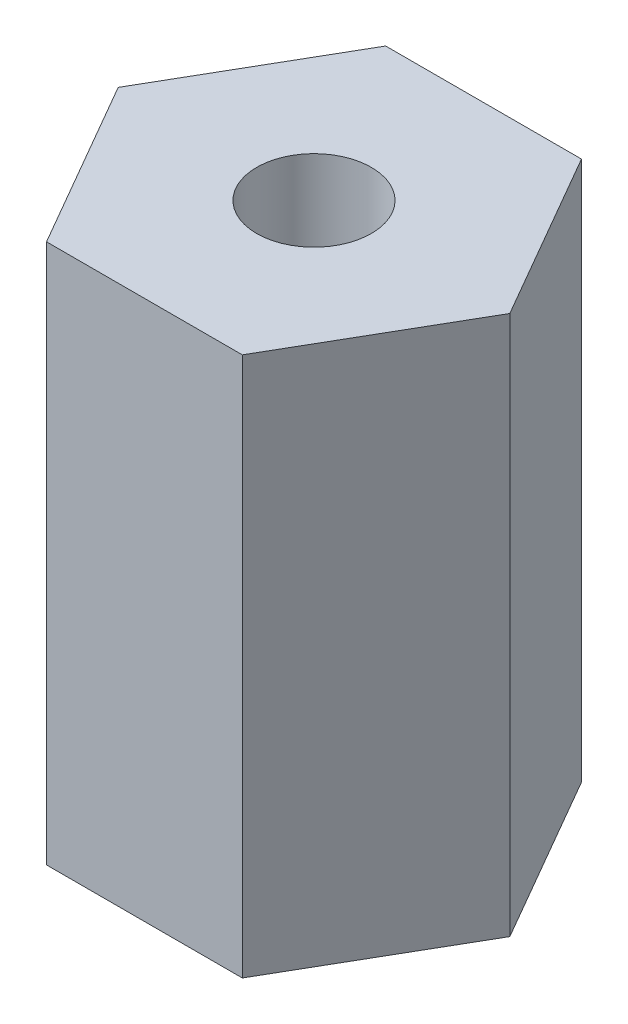
ISO-10303-21;
HEADER;
FILE_DESCRIPTION(('STEP AP214'),'2;1');
FILE_NAME('part.step','',(''),(''),'','','');
FILE_SCHEMA(('AUTOMOTIVE_DESIGN { 1 0 10303 214 1 1 1 1 }'));
ENDSEC;
DATA;
#1=APPLICATION_CONTEXT('core data for automotive mechanical design processes');
#2=APPLICATION_PROTOCOL_DEFINITION('international standard','automotive_design',2000,#1);
#3=PRODUCT_CONTEXT('',#1,'mechanical');
#4=PRODUCT('Part','Part','',(#3));
#5=PRODUCT_RELATED_PRODUCT_CATEGORY('part','',(#4));
#6=PRODUCT_DEFINITION_FORMATION('','',#4);
#7=PRODUCT_DEFINITION_CONTEXT('part definition',#1,'design');
#8=PRODUCT_DEFINITION('design','',#6,#7);
#9=PRODUCT_DEFINITION_SHAPE('','',#8);
#10=(LENGTH_UNIT() NAMED_UNIT(*) SI_UNIT(.MILLI.,.METRE.));
#11=(NAMED_UNIT(*) PLANE_ANGLE_UNIT() SI_UNIT($,.RADIAN.));
#12=(NAMED_UNIT(*) SI_UNIT($,.STERADIAN.) SOLID_ANGLE_UNIT());
#13=UNCERTAINTY_MEASURE_WITH_UNIT(LENGTH_MEASURE(1.E-05),#10,'distance_accuracy_value','');
#14=(GEOMETRIC_REPRESENTATION_CONTEXT(3) GLOBAL_UNCERTAINTY_ASSIGNED_CONTEXT((#13)) GLOBAL_UNIT_ASSIGNED_CONTEXT((#10,
#11,#12)) REPRESENTATION_CONTEXT('',''));
#15=CARTESIAN_POINT('',(0.,0.,0.));
#16=DIRECTION('',(0.,0.,1.));
#17=DIRECTION('',(1.,0.,0.));
#18=AXIS2_PLACEMENT_3D('',#15,#16,#17);
#19=CARTESIAN_POINT('',(2.3094010767585,12.73,-4.));
#20=DIRECTION('',(0.,0.,1.));
#21=DIRECTION('',(1.,0.,0.));
#22=AXIS2_PLACEMENT_3D('',#19,#20,#21);
#23=PLANE('',#22);
#24=DIRECTION('',(-1.,0.,0.));
#25=VECTOR('',#24,1.);
#26=CARTESIAN_POINT('',(2.3094010767585,0.,-4.));
#27=LINE('',#26,#25);
#28=CARTESIAN_POINT('',(2.3094010767585,0.,-4.));
#29=VERTEX_POINT('',#28);
#30=CARTESIAN_POINT('',(-2.3094010767585,0.,-4.));
#31=VERTEX_POINT('',#30);
#32=EDGE_CURVE('E128',#29,#31,#27,.T.);
#33=ORIENTED_EDGE('',*,*,#32,.T.);
#34=DIRECTION('',(0.,-1.,0.));
#35=VECTOR('',#34,1.);
#36=CARTESIAN_POINT('',(-2.3094010767585,12.73,-4.));
#37=LINE('',#36,#35);
#38=CARTESIAN_POINT('',(-2.3094010767585,12.73,-4.));
#39=VERTEX_POINT('',#38);
#40=EDGE_CURVE('E11',#39,#31,#37,.T.);
#41=ORIENTED_EDGE('',*,*,#40,.F.);
#42=DIRECTION('',(-1.,0.,0.));
#43=VECTOR('',#42,1.);
#44=CARTESIAN_POINT('',(2.3094010767585,12.73,-4.));
#45=LINE('',#44,#43);
#46=CARTESIAN_POINT('',(2.3094010767585,12.73,-4.));
#47=VERTEX_POINT('',#46);
#48=EDGE_CURVE('E145',#47,#39,#45,.T.);
#49=ORIENTED_EDGE('',*,*,#48,.F.);
#50=DIRECTION('',(0.,-1.,0.));
#51=VECTOR('',#50,1.);
#52=CARTESIAN_POINT('',(2.3094010767585,12.73,-4.));
#53=LINE('',#52,#51);
#54=EDGE_CURVE('E124',#47,#29,#53,.T.);
#55=ORIENTED_EDGE('',*,*,#54,.T.);
#56=EDGE_LOOP('',(#33,#41,#49,#55));
#57=FACE_BOUND('',#56,.T.);
#58=ADVANCED_FACE('F39',(#57),#23,.F.);
#59=CARTESIAN_POINT('',(-2.3094010767585,12.73,-4.));
#60=DIRECTION('',(0.866025403784439,0.,0.5));
#61=DIRECTION('',(0.5,0.,-0.866025403784439));
#62=AXIS2_PLACEMENT_3D('',#59,#60,#61);
#63=PLANE('',#62);
#64=DIRECTION('',(-0.5,0.,0.866025403784439));
#65=VECTOR('',#64,1.);
#66=CARTESIAN_POINT('',(-2.3094010767585,0.,-4.));
#67=LINE('',#66,#65);
#68=CARTESIAN_POINT('',(-4.61880215351701,0.,0.));
#69=VERTEX_POINT('',#68);
#70=EDGE_CURVE('E132',#31,#69,#67,.T.);
#71=ORIENTED_EDGE('',*,*,#70,.T.);
#72=DIRECTION('',(0.,-1.,0.));
#73=VECTOR('',#72,1.);
#74=CARTESIAN_POINT('',(-4.61880215351701,12.73,0.));
#75=LINE('',#74,#73);
#76=CARTESIAN_POINT('',(-4.61880215351701,12.73,0.));
#77=VERTEX_POINT('',#76);
#78=EDGE_CURVE('E48',#77,#69,#75,.T.);
#79=ORIENTED_EDGE('',*,*,#78,.F.);
#80=DIRECTION('',(-0.5,0.,0.866025403784439));
#81=VECTOR('',#80,1.);
#82=CARTESIAN_POINT('',(-2.3094010767585,12.73,-4.));
#83=LINE('',#82,#81);
#84=EDGE_CURVE('E93',#39,#77,#83,.T.);
#85=ORIENTED_EDGE('',*,*,#84,.F.);
#86=ORIENTED_EDGE('',*,*,#40,.T.);
#87=EDGE_LOOP('',(#71,#79,#85,#86));
#88=FACE_BOUND('',#87,.T.);
#89=ADVANCED_FACE('F174',(#88),#63,.F.);
#90=CARTESIAN_POINT('',(-4.61880215351701,12.73,0.));
#91=DIRECTION('',(0.866025403784439,0.,-0.5));
#92=DIRECTION('',(-0.5,0.,-0.866025403784439));
#93=AXIS2_PLACEMENT_3D('',#90,#91,#92);
#94=PLANE('',#93);
#95=DIRECTION('',(0.5,0.,0.866025403784439));
#96=VECTOR('',#95,1.);
#97=CARTESIAN_POINT('',(-4.61880215351701,0.,0.));
#98=LINE('',#97,#96);
#99=CARTESIAN_POINT('',(-2.3094010767585,0.,4.));
#100=VERTEX_POINT('',#99);
#101=EDGE_CURVE('E136',#69,#100,#98,.T.);
#102=ORIENTED_EDGE('',*,*,#101,.T.);
#103=DIRECTION('',(0.,-1.,0.));
#104=VECTOR('',#103,1.);
#105=CARTESIAN_POINT('',(-2.3094010767585,12.73,4.));
#106=LINE('',#105,#104);
#107=CARTESIAN_POINT('',(-2.3094010767585,12.73,4.));
#108=VERTEX_POINT('',#107);
#109=EDGE_CURVE('E117',#108,#100,#106,.T.);
#110=ORIENTED_EDGE('',*,*,#109,.F.);
#111=DIRECTION('',(0.5,0.,0.866025403784439));
#112=VECTOR('',#111,1.);
#113=CARTESIAN_POINT('',(-4.61880215351701,12.73,0.));
#114=LINE('',#113,#112);
#115=EDGE_CURVE('E106',#77,#108,#114,.T.);
#116=ORIENTED_EDGE('',*,*,#115,.F.);
#117=ORIENTED_EDGE('',*,*,#78,.T.);
#118=EDGE_LOOP('',(#102,#110,#116,#117));
#119=FACE_BOUND('',#118,.T.);
#120=ADVANCED_FACE('F155',(#119),#94,.F.);
#121=CARTESIAN_POINT('',(-2.3094010767585,12.73,4.));
#122=DIRECTION('',(0.,0.,-1.));
#123=DIRECTION('',(-1.,0.,0.));
#124=AXIS2_PLACEMENT_3D('',#121,#122,#123);
#125=PLANE('',#124);
#126=DIRECTION('',(1.,0.,0.));
#127=VECTOR('',#126,1.);
#128=CARTESIAN_POINT('',(-2.3094010767585,0.,4.));
#129=LINE('',#128,#127);
#130=CARTESIAN_POINT('',(2.3094010767585,0.,4.));
#131=VERTEX_POINT('',#130);
#132=EDGE_CURVE('E115',#100,#131,#129,.T.);
#133=ORIENTED_EDGE('',*,*,#132,.T.);
#134=DIRECTION('',(0.,-1.,0.));
#135=VECTOR('',#134,1.);
#136=CARTESIAN_POINT('',(2.3094010767585,12.73,4.));
#137=LINE('',#136,#135);
#138=CARTESIAN_POINT('',(2.3094010767585,12.73,4.));
#139=VERTEX_POINT('',#138);
#140=EDGE_CURVE('E112',#139,#131,#137,.T.);
#141=ORIENTED_EDGE('',*,*,#140,.F.);
#142=DIRECTION('',(1.,0.,0.));
#143=VECTOR('',#142,1.);
#144=CARTESIAN_POINT('',(-2.3094010767585,12.73,4.));
#145=LINE('',#144,#143);
#146=EDGE_CURVE('E100',#108,#139,#145,.T.);
#147=ORIENTED_EDGE('',*,*,#146,.F.);
#148=ORIENTED_EDGE('',*,*,#109,.T.);
#149=EDGE_LOOP('',(#133,#141,#147,#148));
#150=FACE_BOUND('',#149,.T.);
#151=ADVANCED_FACE('F113',(#150),#125,.F.);
#152=CARTESIAN_POINT('',(2.3094010767585,12.73,4.));
#153=DIRECTION('',(-0.866025403784439,0.,-0.5));
#154=DIRECTION('',(-0.5,0.,0.866025403784439));
#155=AXIS2_PLACEMENT_3D('',#152,#153,#154);
#156=PLANE('',#155);
#157=DIRECTION('',(0.5,0.,-0.866025403784439));
#158=VECTOR('',#157,1.);
#159=CARTESIAN_POINT('',(2.3094010767585,0.,4.));
#160=LINE('',#159,#158);
#161=CARTESIAN_POINT('',(4.61880215351701,0.,0.));
#162=VERTEX_POINT('',#161);
#163=EDGE_CURVE('E79',#131,#162,#160,.T.);
#164=ORIENTED_EDGE('',*,*,#163,.T.);
#165=DIRECTION('',(0.,-1.,0.));
#166=VECTOR('',#165,1.);
#167=CARTESIAN_POINT('',(4.61880215351701,12.73,0.));
#168=LINE('',#167,#166);
#169=CARTESIAN_POINT('',(4.61880215351701,12.73,0.));
#170=VERTEX_POINT('',#169);
#171=EDGE_CURVE('E118',#170,#162,#168,.T.);
#172=ORIENTED_EDGE('',*,*,#171,.F.);
#173=DIRECTION('',(0.5,0.,-0.866025403784439));
#174=VECTOR('',#173,1.);
#175=CARTESIAN_POINT('',(2.3094010767585,12.73,4.));
#176=LINE('',#175,#174);
#177=EDGE_CURVE('E104',#139,#170,#176,.T.);
#178=ORIENTED_EDGE('',*,*,#177,.F.);
#179=ORIENTED_EDGE('',*,*,#140,.T.);
#180=EDGE_LOOP('',(#164,#172,#178,#179));
#181=FACE_BOUND('',#180,.T.);
#182=ADVANCED_FACE('F120',(#181),#156,.F.);
#183=CARTESIAN_POINT('',(4.61880215351701,12.73,0.));
#184=DIRECTION('',(-0.866025403784439,0.,0.5));
#185=DIRECTION('',(0.5,0.,0.866025403784439));
#186=AXIS2_PLACEMENT_3D('',#183,#184,#185);
#187=PLANE('',#186);
#188=DIRECTION('',(-0.5,0.,-0.866025403784439));
#189=VECTOR('',#188,1.);
#190=CARTESIAN_POINT('',(4.61880215351701,0.,0.));
#191=LINE('',#190,#189);
#192=EDGE_CURVE('E85',#162,#29,#191,.T.);
#193=ORIENTED_EDGE('',*,*,#192,.T.);
#194=ORIENTED_EDGE('',*,*,#54,.F.);
#195=DIRECTION('',(-0.5,0.,-0.866025403784439));
#196=VECTOR('',#195,1.);
#197=CARTESIAN_POINT('',(4.61880215351701,12.73,0.));
#198=LINE('',#197,#196);
#199=EDGE_CURVE('E56',#170,#47,#198,.T.);
#200=ORIENTED_EDGE('',*,*,#199,.F.);
#201=ORIENTED_EDGE('',*,*,#171,.T.);
#202=EDGE_LOOP('',(#193,#194,#200,#201));
#203=FACE_BOUND('',#202,.T.);
#204=ADVANCED_FACE('F162',(#203),#187,.F.);
#205=CARTESIAN_POINT('',(0.,12.73,0.));
#206=DIRECTION('',(0.,1.,0.));
#207=DIRECTION('',(0.,0.,1.));
#208=AXIS2_PLACEMENT_3D('',#205,#206,#207);
#209=PLANE('',#208);
#210=CARTESIAN_POINT('',(0.,12.73,0.));
#211=DIRECTION('',(0.,1.,0.));
#212=DIRECTION('',(0.,0.,1.));
#213=AXIS2_PLACEMENT_3D('',#210,#211,#212);
#214=CIRCLE('',#213,1.35255);
#215=CARTESIAN_POINT('',(0.,12.73,1.35255));
#216=VERTEX_POINT('',#215);
#217=EDGE_CURVE('E258',#216,#216,#214,.T.);
#218=ORIENTED_EDGE('',*,*,#217,.F.);
#219=EDGE_LOOP('',(#218));
#220=FACE_BOUND('',#219,.T.);
#221=ORIENTED_EDGE('',*,*,#48,.T.);
#222=ORIENTED_EDGE('',*,*,#84,.T.);
#223=ORIENTED_EDGE('',*,*,#115,.T.);
#224=ORIENTED_EDGE('',*,*,#146,.T.);
#225=ORIENTED_EDGE('',*,*,#177,.T.);
#226=ORIENTED_EDGE('',*,*,#199,.T.);
#227=EDGE_LOOP('',(#221,#222,#223,#224,#225,#226));
#228=FACE_BOUND('',#227,.T.);
#229=ADVANCED_FACE('F102',(#220,#228),#209,.T.);
#230=CARTESIAN_POINT('',(0.,0.,0.));
#231=DIRECTION('',(0.,1.,0.));
#232=DIRECTION('',(0.,0.,1.));
#233=AXIS2_PLACEMENT_3D('',#230,#231,#232);
#234=PLANE('',#233);
#235=CARTESIAN_POINT('',(0.,0.,0.));
#236=DIRECTION('',(0.,-1.,0.));
#237=DIRECTION('',(0.,0.,-1.));
#238=AXIS2_PLACEMENT_3D('',#235,#236,#237);
#239=CIRCLE('',#238,0.353459892928966);
#240=CARTESIAN_POINT('',(0.,0.,-0.353459892928966));
#241=VERTEX_POINT('',#240);
#242=EDGE_CURVE('E259',#241,#241,#239,.T.);
#243=ORIENTED_EDGE('',*,*,#242,.F.);
#244=EDGE_LOOP('',(#243));
#245=FACE_BOUND('',#244,.T.);
#246=ORIENTED_EDGE('',*,*,#32,.F.);
#247=ORIENTED_EDGE('',*,*,#192,.F.);
#248=ORIENTED_EDGE('',*,*,#163,.F.);
#249=ORIENTED_EDGE('',*,*,#132,.F.);
#250=ORIENTED_EDGE('',*,*,#101,.F.);
#251=ORIENTED_EDGE('',*,*,#70,.F.);
#252=EDGE_LOOP('',(#246,#247,#248,#249,#250,#251));
#253=FACE_BOUND('',#252,.T.);
#254=ADVANCED_FACE('F158',(#245,#253),#234,.F.);
#255=CARTESIAN_POINT('',(0.,6.73,0.));
#256=DIRECTION('',(0.,1.,0.));
#257=DIRECTION('',(0.,0.,1.));
#258=AXIS2_PLACEMENT_3D('',#255,#256,#257);
#259=CYLINDRICAL_SURFACE('',#258,1.35255);
#260=CARTESIAN_POINT('',(0.,6.73,0.));
#261=DIRECTION('',(0.,1.,0.));
#262=DIRECTION('',(0.,0.,1.));
#263=AXIS2_PLACEMENT_3D('',#260,#261,#262);
#264=CIRCLE('',#263,1.35255);
#265=CARTESIAN_POINT('',(0.,6.73,1.35255));
#266=VERTEX_POINT('',#265);
#267=EDGE_CURVE('E133',#266,#266,#264,.T.);
#268=ORIENTED_EDGE('',*,*,#267,.F.);
#269=EDGE_LOOP('',(#268));
#270=FACE_BOUND('',#269,.T.);
#271=ORIENTED_EDGE('',*,*,#217,.T.);
#272=EDGE_LOOP('',(#271));
#273=FACE_BOUND('',#272,.T.);
#274=ADVANCED_FACE('F209',(#270,#273),#259,.F.);
#275=CARTESIAN_POINT('',(0.,6.73,0.));
#276=DIRECTION('',(0.,1.,0.));
#277=DIRECTION('',(0.,0.,1.));
#278=AXIS2_PLACEMENT_3D('',#275,#276,#277);
#279=PLANE('',#278);
#280=ORIENTED_EDGE('',*,*,#267,.T.);
#281=EDGE_LOOP('',(#280));
#282=FACE_BOUND('',#281,.T.);
#283=ADVANCED_FACE('F214',(#282),#279,.T.);
#284=CARTESIAN_POINT('',(0.,1.,0.));
#285=DIRECTION('',(0.,-1.,0.));
#286=DIRECTION('',(0.,0.,-1.));
#287=AXIS2_PLACEMENT_3D('',#284,#285,#286);
#288=CYLINDRICAL_SURFACE('',#287,0.353459892928966);
#289=CARTESIAN_POINT('',(0.,1.,0.));
#290=DIRECTION('',(0.,-1.,0.));
#291=DIRECTION('',(0.,0.,-1.));
#292=AXIS2_PLACEMENT_3D('',#289,#290,#291);
#293=CIRCLE('',#292,0.353459892928966);
#294=CARTESIAN_POINT('',(0.,1.,-0.353459892928966));
#295=VERTEX_POINT('',#294);
#296=EDGE_CURVE('E256',#295,#295,#293,.T.);
#297=ORIENTED_EDGE('',*,*,#296,.F.);
#298=EDGE_LOOP('',(#297));
#299=FACE_BOUND('',#298,.T.);
#300=ORIENTED_EDGE('',*,*,#242,.T.);
#301=EDGE_LOOP('',(#300));
#302=FACE_BOUND('',#301,.T.);
#303=ADVANCED_FACE('F224',(#299,#302),#288,.F.);
#304=CARTESIAN_POINT('',(0.,1.,0.));
#305=DIRECTION('',(0.,-1.,0.));
#306=DIRECTION('',(0.,0.,-1.));
#307=AXIS2_PLACEMENT_3D('',#304,#305,#306);
#308=PLANE('',#307);
#309=ORIENTED_EDGE('',*,*,#296,.T.);
#310=EDGE_LOOP('',(#309));
#311=FACE_BOUND('',#310,.T.);
#312=ADVANCED_FACE('F240',(#311),#308,.T.);
#313=CLOSED_SHELL('',(#58,#89,#120,#151,#182,#204,#229,#254,#274,#283,#303,#312));
#314=MANIFOLD_SOLID_BREP('B2',#313);
#315=ADVANCED_BREP_SHAPE_REPRESENTATION('',(#18,#314),#14);
#316=SHAPE_DEFINITION_REPRESENTATION(#9,#315);
ENDSEC;
END-ISO-10303-21;
